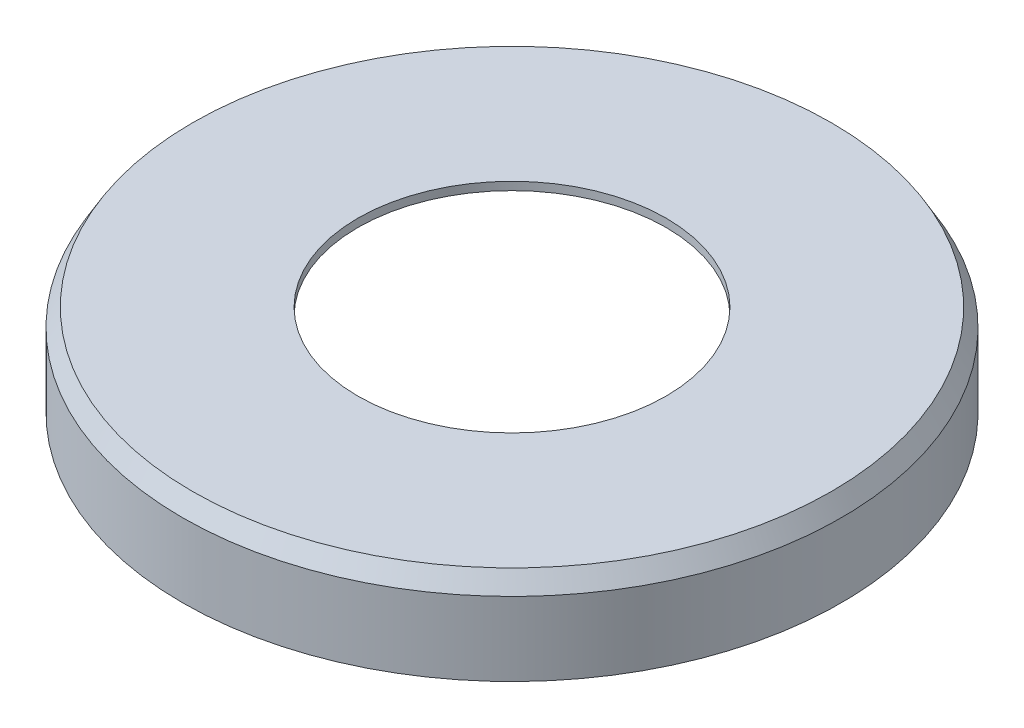
ISO-10303-21;
HEADER;
FILE_DESCRIPTION(('STEP AP214'),'2;1');
FILE_NAME('part.step','',(''),(''),'','','');
FILE_SCHEMA(('AUTOMOTIVE_DESIGN { 1 0 10303 214 1 1 1 1 }'));
ENDSEC;
DATA;
#1=APPLICATION_CONTEXT('core data for automotive mechanical design processes');
#2=APPLICATION_PROTOCOL_DEFINITION('international standard','automotive_design',2000,#1);
#3=PRODUCT_CONTEXT('',#1,'mechanical');
#4=PRODUCT('Part','Part','',(#3));
#5=PRODUCT_RELATED_PRODUCT_CATEGORY('part','',(#4));
#6=PRODUCT_DEFINITION_FORMATION('','',#4);
#7=PRODUCT_DEFINITION_CONTEXT('part definition',#1,'design');
#8=PRODUCT_DEFINITION('design','',#6,#7);
#9=PRODUCT_DEFINITION_SHAPE('','',#8);
#10=(LENGTH_UNIT() NAMED_UNIT(*) SI_UNIT(.MILLI.,.METRE.));
#11=(NAMED_UNIT(*) PLANE_ANGLE_UNIT() SI_UNIT($,.RADIAN.));
#12=(NAMED_UNIT(*) SI_UNIT($,.STERADIAN.) SOLID_ANGLE_UNIT());
#13=UNCERTAINTY_MEASURE_WITH_UNIT(LENGTH_MEASURE(1.E-05),#10,'distance_accuracy_value','');
#14=(GEOMETRIC_REPRESENTATION_CONTEXT(3) GLOBAL_UNCERTAINTY_ASSIGNED_CONTEXT((#13)) GLOBAL_UNIT_ASSIGNED_CONTEXT((#10,
#11,#12)) REPRESENTATION_CONTEXT('',''));
#15=CARTESIAN_POINT('',(0.,0.,0.));
#16=DIRECTION('',(0.,0.,1.));
#17=DIRECTION('',(1.,0.,0.));
#18=AXIS2_PLACEMENT_3D('',#15,#16,#17);
#19=CARTESIAN_POINT('',(0.,9.,0.));
#20=DIRECTION('',(0.,-1.,0.));
#21=DIRECTION('',(0.,0.,-1.));
#22=AXIS2_PLACEMENT_3D('',#19,#20,#21);
#23=CYLINDRICAL_SURFACE('',#22,15.2);
#24=CARTESIAN_POINT('',(0.,9.,0.));
#25=DIRECTION('',(0.,-1.,0.));
#26=DIRECTION('',(0.,0.,-1.));
#27=AXIS2_PLACEMENT_3D('',#24,#25,#26);
#28=CIRCLE('',#27,15.2);
#29=CARTESIAN_POINT('',(0.,9.,-15.2));
#30=VERTEX_POINT('',#29);
#31=EDGE_CURVE('E153',#30,#30,#28,.T.);
#32=ORIENTED_EDGE('',*,*,#31,.F.);
#33=EDGE_LOOP('',(#32));
#34=FACE_BOUND('',#33,.T.);
#35=CARTESIAN_POINT('',(0.,8.2,0.));
#36=DIRECTION('',(0.,-1.,0.));
#37=DIRECTION('',(0.,0.,-1.));
#38=AXIS2_PLACEMENT_3D('',#35,#36,#37);
#39=CIRCLE('',#38,15.2);
#40=CARTESIAN_POINT('',(0.,8.2,-15.2));
#41=VERTEX_POINT('',#40);
#42=EDGE_CURVE('E44',#41,#41,#39,.F.);
#43=ORIENTED_EDGE('',*,*,#42,.F.);
#44=EDGE_LOOP('',(#43));
#45=FACE_BOUND('',#44,.T.);
#46=ADVANCED_FACE('F39',(#34,#45),#23,.F.);
#47=CARTESIAN_POINT('',(0.,-82.731493398826,0.));
#48=DIRECTION('',(0.,1.,0.));
#49=DIRECTION('',(0.,0.,1.));
#50=AXIS2_PLACEMENT_3D('',#47,#48,#49);
#51=CYLINDRICAL_SURFACE('',#50,29.25);
#52=CARTESIAN_POINT('',(0.,0.,0.));
#53=DIRECTION('',(0.,1.,0.));
#54=DIRECTION('',(0.,0.,1.));
#55=AXIS2_PLACEMENT_3D('',#52,#53,#54);
#56=CIRCLE('',#55,29.25);
#57=CARTESIAN_POINT('',(-21.2063607461421,0.,-20.1457877459404));
#58=VERTEX_POINT('',#57);
#59=CARTESIAN_POINT('',(-21.2063607461424,0.,20.1457877459401));
#60=VERTEX_POINT('',#59);
#61=EDGE_CURVE('E56',#58,#60,#56,.T.);
#62=ORIENTED_EDGE('',*,*,#61,.F.);
#63=DIRECTION('',(0.,1.,0.));
#64=VECTOR('',#63,1.);
#65=CARTESIAN_POINT('',(-21.2063607461421,-16.7120855197695,-20.1457877459405));
#66=LINE('',#65,#64);
#67=CARTESIAN_POINT('',(-21.2063607461421,7.,-20.1457877459404));
#68=VERTEX_POINT('',#67);
#69=EDGE_CURVE('E163',#58,#68,#66,.T.);
#70=ORIENTED_EDGE('',*,*,#69,.T.);
#71=CARTESIAN_POINT('',(0.,7.,0.));
#72=DIRECTION('',(0.,-1.,0.));
#73=DIRECTION('',(0.,0.,-1.));
#74=AXIS2_PLACEMENT_3D('',#71,#72,#73);
#75=CIRCLE('',#74,29.25);
#76=CARTESIAN_POINT('',(-21.2063607461424,7.,20.1457877459401));
#77=VERTEX_POINT('',#76);
#78=EDGE_CURVE('E230',#77,#68,#75,.T.);
#79=ORIENTED_EDGE('',*,*,#78,.F.);
#80=DIRECTION('',(0.,1.,0.));
#81=VECTOR('',#80,1.);
#82=CARTESIAN_POINT('',(-21.2063607461424,-16.7120855197695,20.1457877459402));
#83=LINE('',#82,#81);
#84=EDGE_CURVE('E186',#60,#77,#83,.T.);
#85=ORIENTED_EDGE('',*,*,#84,.F.);
#86=EDGE_LOOP('',(#62,#70,#79,#85));
#87=FACE_BOUND('',#86,.T.);
#88=ADVANCED_FACE('F254',(#87),#51,.F.);
#89=CARTESIAN_POINT('',(-6.84358359416209,7.,-28.4381410009465));
#90=VERTEX_POINT('',#89);
#91=CARTESIAN_POINT('',(28.0499443403046,7.,-8.29235325500622));
#92=VERTEX_POINT('',#91);
#93=EDGE_CURVE('E206',#90,#92,#75,.T.);
#94=ORIENTED_EDGE('',*,*,#93,.F.);
#95=DIRECTION('',(0.,1.,0.));
#96=VECTOR('',#95,1.);
#97=CARTESIAN_POINT('',(-6.84358359416211,-16.7120855197695,-28.4381410009465));
#98=LINE('',#97,#96);
#99=CARTESIAN_POINT('',(-6.84358359416209,0.,-28.4381410009465));
#100=VERTEX_POINT('',#99);
#101=EDGE_CURVE('E64',#100,#90,#98,.T.);
#102=ORIENTED_EDGE('',*,*,#101,.F.);
#103=CARTESIAN_POINT('',(28.0499443403046,0.,-8.29235325500619));
#104=VERTEX_POINT('',#103);
#105=EDGE_CURVE('E231',#104,#100,#56,.T.);
#106=ORIENTED_EDGE('',*,*,#105,.F.);
#107=DIRECTION('',(0.,1.,0.));
#108=VECTOR('',#107,1.);
#109=CARTESIAN_POINT('',(28.0499443403046,-16.6764308126348,-8.29235325500619));
#110=LINE('',#109,#108);
#111=EDGE_CURVE('E218',#104,#92,#110,.T.);
#112=ORIENTED_EDGE('',*,*,#111,.T.);
#113=EDGE_LOOP('',(#94,#102,#106,#112));
#114=FACE_BOUND('',#113,.T.);
#115=ADVANCED_FACE('F260',(#114),#51,.F.);
#116=CARTESIAN_POINT('',(-6.84358359416249,0.,28.4381410009464));
#117=VERTEX_POINT('',#116);
#118=CARTESIAN_POINT('',(28.0499443403046,0.,8.29235325500619));
#119=VERTEX_POINT('',#118);
#120=EDGE_CURVE('E229',#117,#119,#56,.T.);
#121=ORIENTED_EDGE('',*,*,#120,.F.);
#122=DIRECTION('',(0.,1.,0.));
#123=VECTOR('',#122,1.);
#124=CARTESIAN_POINT('',(-6.84358359416251,-16.7120855197695,28.4381410009464));
#125=LINE('',#124,#123);
#126=CARTESIAN_POINT('',(-6.84358359416249,7.,28.4381410009464));
#127=VERTEX_POINT('',#126);
#128=EDGE_CURVE('E189',#117,#127,#125,.T.);
#129=ORIENTED_EDGE('',*,*,#128,.T.);
#130=CARTESIAN_POINT('',(28.0499443403046,7.,8.29235325500622));
#131=VERTEX_POINT('',#130);
#132=EDGE_CURVE('E226',#131,#127,#75,.T.);
#133=ORIENTED_EDGE('',*,*,#132,.F.);
#134=DIRECTION('',(0.,1.,0.));
#135=VECTOR('',#134,1.);
#136=CARTESIAN_POINT('',(28.0499443403046,-16.6764308126348,8.29235325500619));
#137=LINE('',#136,#135);
#138=EDGE_CURVE('E215',#119,#131,#137,.T.);
#139=ORIENTED_EDGE('',*,*,#138,.F.);
#140=EDGE_LOOP('',(#121,#129,#133,#139));
#141=FACE_BOUND('',#140,.T.);
#142=ADVANCED_FACE('F262',(#141),#51,.F.);
#143=CARTESIAN_POINT('',(0.,0.,0.));
#144=DIRECTION('',(0.,1.,0.));
#145=DIRECTION('',(0.,0.,1.));
#146=AXIS2_PLACEMENT_3D('',#143,#144,#145);
#147=PLANE('',#146);
#148=ORIENTED_EDGE('',*,*,#105,.T.);
#149=CARTESIAN_POINT('',(-7.57045706924845,0.,-28.2533304189553));
#150=DIRECTION('',(0.,1.,0.));
#151=DIRECTION('',(0.,0.,1.));
#152=AXIS2_PLACEMENT_3D('',#149,#150,#151);
#153=CIRCLE('',#152,0.750000000000001);
#154=CARTESIAN_POINT('',(-7.37634278542157,0.,-27.5288860492385));
#155=VERTEX_POINT('',#154);
#156=EDGE_CURVE('E158',#155,#100,#153,.T.);
#157=ORIENTED_EDGE('',*,*,#156,.F.);
#158=CARTESIAN_POINT('',(0.,0.,0.));
#159=DIRECTION('',(0.,1.,0.));
#160=DIRECTION('',(0.,0.,1.));
#161=AXIS2_PLACEMENT_3D('',#158,#159,#160);
#162=CIRCLE('',#161,28.5);
#163=CARTESIAN_POINT('',(-20.1525432638164,0.,-20.1525432638168));
#164=VERTEX_POINT('',#163);
#165=EDGE_CURVE('E146',#164,#155,#162,.F.);
#166=ORIENTED_EDGE('',*,*,#165,.F.);
#167=CARTESIAN_POINT('',(-20.6828733497063,0.,-20.6828733497067));
#168=DIRECTION('',(0.,1.,0.));
#169=DIRECTION('',(0.,0.,1.));
#170=AXIS2_PLACEMENT_3D('',#167,#168,#169);
#171=CIRCLE('',#170,0.750000000000001);
#172=EDGE_CURVE('E149',#58,#164,#171,.T.);
#173=ORIENTED_EDGE('',*,*,#172,.F.);
#174=ORIENTED_EDGE('',*,*,#61,.T.);
#175=CARTESIAN_POINT('',(-20.6828733497066,0.,20.6828733497064));
#176=DIRECTION('',(0.,1.,0.));
#177=DIRECTION('',(0.,0.,1.));
#178=AXIS2_PLACEMENT_3D('',#175,#176,#177);
#179=CIRCLE('',#178,0.750000000000001);
#180=CARTESIAN_POINT('',(-20.1525432638167,0.,20.1525432638165));
#181=VERTEX_POINT('',#180);
#182=EDGE_CURVE('E173',#181,#60,#179,.T.);
#183=ORIENTED_EDGE('',*,*,#182,.F.);
#184=CARTESIAN_POINT('',(0.,0.,0.));
#185=DIRECTION('',(0.,1.,0.));
#186=DIRECTION('',(0.,0.,1.));
#187=AXIS2_PLACEMENT_3D('',#184,#185,#186);
#188=CIRCLE('',#187,28.5);
#189=CARTESIAN_POINT('',(-7.37634278542195,0.,27.5288860492384));
#190=VERTEX_POINT('',#189);
#191=EDGE_CURVE('E169',#190,#181,#188,.F.);
#192=ORIENTED_EDGE('',*,*,#191,.F.);
#193=CARTESIAN_POINT('',(-7.57045706924884,0.,28.2533304189552));
#194=DIRECTION('',(0.,1.,0.));
#195=DIRECTION('',(0.,0.,1.));
#196=AXIS2_PLACEMENT_3D('',#193,#194,#195);
#197=CIRCLE('',#196,0.750000000000001);
#198=EDGE_CURVE('E166',#117,#190,#197,.T.);
#199=ORIENTED_EDGE('',*,*,#198,.F.);
#200=ORIENTED_EDGE('',*,*,#120,.T.);
#201=CARTESIAN_POINT('',(28.2533304189552,0.,7.57045706924876));
#202=DIRECTION('',(0.,1.,0.));
#203=DIRECTION('',(0.,0.,1.));
#204=AXIS2_PLACEMENT_3D('',#201,#202,#203);
#205=CIRCLE('',#204,0.750000000000001);
#206=CARTESIAN_POINT('',(27.5288860492384,0.,7.37634278542187));
#207=VERTEX_POINT('',#206);
#208=EDGE_CURVE('E203',#207,#119,#205,.T.);
#209=ORIENTED_EDGE('',*,*,#208,.F.);
#210=CARTESIAN_POINT('',(0.,0.,0.));
#211=DIRECTION('',(0.,1.,0.));
#212=DIRECTION('',(0.,0.,1.));
#213=AXIS2_PLACEMENT_3D('',#210,#211,#212);
#214=CIRCLE('',#213,28.5);
#215=CARTESIAN_POINT('',(27.5288860492384,0.,-7.37634278542186));
#216=VERTEX_POINT('',#215);
#217=EDGE_CURVE('E199',#216,#207,#214,.F.);
#218=ORIENTED_EDGE('',*,*,#217,.F.);
#219=CARTESIAN_POINT('',(28.2533304189552,0.,-7.57045706924876));
#220=DIRECTION('',(0.,1.,0.));
#221=DIRECTION('',(0.,0.,1.));
#222=AXIS2_PLACEMENT_3D('',#219,#220,#221);
#223=CIRCLE('',#222,0.750000000000001);
#224=EDGE_CURVE('E196',#104,#216,#223,.T.);
#225=ORIENTED_EDGE('',*,*,#224,.F.);
#226=EDGE_LOOP('',(#148,#157,#166,#173,#174,#183,#192,#199,#200,#209,#218,#225));
#227=FACE_BOUND('',#226,.T.);
#228=CARTESIAN_POINT('',(0.,0.,0.));
#229=DIRECTION('',(0.,1.,0.));
#230=DIRECTION('',(0.,0.,1.));
#231=AXIS2_PLACEMENT_3D('',#228,#229,#230);
#232=CIRCLE('',#231,32.5);
#233=CARTESIAN_POINT('',(0.,0.,32.5));
#234=VERTEX_POINT('',#233);
#235=EDGE_CURVE('E233',#234,#234,#232,.T.);
#236=ORIENTED_EDGE('',*,*,#235,.F.);
#237=EDGE_LOOP('',(#236));
#238=FACE_BOUND('',#237,.T.);
#239=ADVANCED_FACE('F298',(#227,#238),#147,.F.);
#240=CARTESIAN_POINT('',(0.,7.,0.));
#241=DIRECTION('',(0.,-1.,0.));
#242=DIRECTION('',(0.,0.,-1.));
#243=AXIS2_PLACEMENT_3D('',#240,#241,#242);
#244=CYLINDRICAL_SURFACE('',#243,32.5);
#245=CARTESIAN_POINT('',(0.,7.26794919243112,0.));
#246=DIRECTION('',(0.,1.,0.));
#247=DIRECTION('',(0.,0.,1.));
#248=AXIS2_PLACEMENT_3D('',#245,#246,#247);
#249=CIRCLE('',#248,32.5);
#250=CARTESIAN_POINT('',(0.,7.26794919243112,32.5));
#251=VERTEX_POINT('',#250);
#252=EDGE_CURVE('E11',#251,#251,#249,.F.);
#253=ORIENTED_EDGE('',*,*,#252,.T.);
#254=EDGE_LOOP('',(#253));
#255=FACE_BOUND('',#254,.T.);
#256=ORIENTED_EDGE('',*,*,#235,.T.);
#257=EDGE_LOOP('',(#256));
#258=FACE_BOUND('',#257,.T.);
#259=ADVANCED_FACE('F302',(#255,#258),#244,.T.);
#260=CARTESIAN_POINT('',(0.,9.,0.));
#261=DIRECTION('',(0.,1.,0.));
#262=DIRECTION('',(0.,0.,1.));
#263=AXIS2_PLACEMENT_3D('',#260,#261,#262);
#264=PLANE('',#263);
#265=ORIENTED_EDGE('',*,*,#31,.T.);
#266=EDGE_LOOP('',(#265));
#267=FACE_BOUND('',#266,.T.);
#268=CARTESIAN_POINT('',(0.,9.,0.));
#269=DIRECTION('',(0.,1.,0.));
#270=DIRECTION('',(0.,0.,1.));
#271=AXIS2_PLACEMENT_3D('',#268,#269,#270);
#272=CIRCLE('',#271,31.5);
#273=CARTESIAN_POINT('',(0.,9.,31.5));
#274=VERTEX_POINT('',#273);
#275=EDGE_CURVE('E49',#274,#274,#272,.T.);
#276=ORIENTED_EDGE('',*,*,#275,.T.);
#277=EDGE_LOOP('',(#276));
#278=FACE_BOUND('',#277,.T.);
#279=ADVANCED_FACE('F239',(#267,#278),#264,.T.);
#280=CARTESIAN_POINT('',(0.,7.,0.));
#281=DIRECTION('',(0.,1.,0.));
#282=DIRECTION('',(0.,0.,1.));
#283=AXIS2_PLACEMENT_3D('',#280,#281,#282);
#284=PLANE('',#283);
#285=CARTESIAN_POINT('',(0.,7.,0.));
#286=DIRECTION('',(0.,-1.,0.));
#287=DIRECTION('',(0.,0.,-1.));
#288=AXIS2_PLACEMENT_3D('',#285,#286,#287);
#289=CIRCLE('',#288,18.);
#290=CARTESIAN_POINT('',(0.,7.,-18.));
#291=VERTEX_POINT('',#290);
#292=EDGE_CURVE('E414',#291,#291,#289,.T.);
#293=ORIENTED_EDGE('',*,*,#292,.F.);
#294=EDGE_LOOP('',(#293));
#295=FACE_BOUND('',#294,.T.);
#296=CARTESIAN_POINT('',(-20.6828733497063,7.,-20.6828733497067));
#297=DIRECTION('',(0.,-1.,0.));
#298=DIRECTION('',(0.866025403784443,0.,-0.499999999999992));
#299=AXIS2_PLACEMENT_3D('',#296,#297,#298);
#300=CIRCLE('',#299,0.750000000000001);
#301=CARTESIAN_POINT('',(-20.1525432638164,7.,-20.1525432638168));
#302=VERTEX_POINT('',#301);
#303=EDGE_CURVE('E137',#302,#68,#300,.T.);
#304=ORIENTED_EDGE('',*,*,#303,.F.);
#305=CARTESIAN_POINT('',(0.,7.,0.));
#306=DIRECTION('',(0.,1.,0.));
#307=DIRECTION('',(0.866025403784443,0.,-0.499999999999992));
#308=AXIS2_PLACEMENT_3D('',#305,#306,#307);
#309=CIRCLE('',#308,28.5);
#310=CARTESIAN_POINT('',(-7.37634278542157,7.,-27.5288860492385));
#311=VERTEX_POINT('',#310);
#312=EDGE_CURVE('E130',#311,#302,#309,.T.);
#313=ORIENTED_EDGE('',*,*,#312,.F.);
#314=CARTESIAN_POINT('',(-7.57045706924845,7.,-28.2533304189553));
#315=DIRECTION('',(0.,-1.,0.));
#316=DIRECTION('',(-0.866025403784443,0.,0.499999999999992));
#317=AXIS2_PLACEMENT_3D('',#314,#315,#316);
#318=CIRCLE('',#317,0.750000000000001);
#319=EDGE_CURVE('E134',#90,#311,#318,.T.);
#320=ORIENTED_EDGE('',*,*,#319,.F.);
#321=ORIENTED_EDGE('',*,*,#93,.T.);
#322=CARTESIAN_POINT('',(28.2533304189552,7.,-7.57045706924876));
#323=DIRECTION('',(0.,-1.,0.));
#324=DIRECTION('',(0.,0.,1.));
#325=AXIS2_PLACEMENT_3D('',#322,#323,#324);
#326=CIRCLE('',#325,0.750000000000001);
#327=CARTESIAN_POINT('',(27.5288860492384,7.,-7.37634278542186));
#328=VERTEX_POINT('',#327);
#329=EDGE_CURVE('E212',#328,#92,#326,.T.);
#330=ORIENTED_EDGE('',*,*,#329,.F.);
#331=CARTESIAN_POINT('',(0.,7.,0.));
#332=DIRECTION('',(0.,1.,0.));
#333=DIRECTION('',(0.,0.,1.));
#334=AXIS2_PLACEMENT_3D('',#331,#332,#333);
#335=CIRCLE('',#334,28.5);
#336=CARTESIAN_POINT('',(27.5288860492384,7.,7.37634278542187));
#337=VERTEX_POINT('',#336);
#338=EDGE_CURVE('E209',#337,#328,#335,.T.);
#339=ORIENTED_EDGE('',*,*,#338,.F.);
#340=CARTESIAN_POINT('',(28.2533304189552,7.,7.57045706924876));
#341=DIRECTION('',(0.,-1.,0.));
#342=DIRECTION('',(0.,0.,-1.));
#343=AXIS2_PLACEMENT_3D('',#340,#341,#342);
#344=CIRCLE('',#343,0.750000000000001);
#345=EDGE_CURVE('E176',#131,#337,#344,.T.);
#346=ORIENTED_EDGE('',*,*,#345,.F.);
#347=ORIENTED_EDGE('',*,*,#132,.T.);
#348=CARTESIAN_POINT('',(-7.57045706924884,7.,28.2533304189552));
#349=DIRECTION('',(0.,-1.,0.));
#350=DIRECTION('',(-0.866025403784436,0.,-0.500000000000004));
#351=AXIS2_PLACEMENT_3D('',#348,#349,#350);
#352=CIRCLE('',#351,0.750000000000001);
#353=CARTESIAN_POINT('',(-7.37634278542195,7.,27.5288860492384));
#354=VERTEX_POINT('',#353);
#355=EDGE_CURVE('E183',#354,#127,#352,.T.);
#356=ORIENTED_EDGE('',*,*,#355,.F.);
#357=CARTESIAN_POINT('',(0.,7.,0.));
#358=DIRECTION('',(0.,1.,0.));
#359=DIRECTION('',(-0.866025403784436,0.,-0.500000000000004));
#360=AXIS2_PLACEMENT_3D('',#357,#358,#359);
#361=CIRCLE('',#360,28.5);
#362=CARTESIAN_POINT('',(-20.1525432638167,7.,20.1525432638165));
#363=VERTEX_POINT('',#362);
#364=EDGE_CURVE('E180',#363,#354,#361,.T.);
#365=ORIENTED_EDGE('',*,*,#364,.F.);
#366=CARTESIAN_POINT('',(-20.6828733497066,7.,20.6828733497064));
#367=DIRECTION('',(0.,-1.,0.));
#368=DIRECTION('',(0.866025403784436,0.,0.500000000000004));
#369=AXIS2_PLACEMENT_3D('',#366,#367,#368);
#370=CIRCLE('',#369,0.750000000000001);
#371=EDGE_CURVE('E177',#77,#363,#370,.T.);
#372=ORIENTED_EDGE('',*,*,#371,.F.);
#373=ORIENTED_EDGE('',*,*,#78,.T.);
#374=EDGE_LOOP('',(#304,#313,#320,#321,#330,#339,#346,#347,#356,#365,#372,#373));
#375=FACE_BOUND('',#374,.T.);
#376=ADVANCED_FACE('F132',(#295,#375),#284,.F.);
#377=CARTESIAN_POINT('',(28.2533304189552,-16.6764308126348,-7.57045706924876));
#378=DIRECTION('',(0.,1.,0.));
#379=DIRECTION('',(0.,0.,1.));
#380=AXIS2_PLACEMENT_3D('',#377,#378,#379);
#381=CYLINDRICAL_SURFACE('',#380,0.750000000000001);
#382=ORIENTED_EDGE('',*,*,#111,.F.);
#383=ORIENTED_EDGE('',*,*,#224,.T.);
#384=DIRECTION('',(0.,1.,0.));
#385=VECTOR('',#384,1.);
#386=CARTESIAN_POINT('',(27.5288860492384,-16.6764308126348,-7.37634278542186));
#387=LINE('',#386,#385);
#388=EDGE_CURVE('E221',#216,#328,#387,.T.);
#389=ORIENTED_EDGE('',*,*,#388,.T.);
#390=ORIENTED_EDGE('',*,*,#329,.T.);
#391=EDGE_LOOP('',(#382,#383,#389,#390));
#392=FACE_BOUND('',#391,.T.);
#393=ADVANCED_FACE('F286',(#392),#381,.T.);
#394=CARTESIAN_POINT('',(0.,-16.6764308126348,0.));
#395=DIRECTION('',(0.,1.,0.));
#396=DIRECTION('',(0.,0.,1.));
#397=AXIS2_PLACEMENT_3D('',#394,#395,#396);
#398=CYLINDRICAL_SURFACE('',#397,28.5);
#399=ORIENTED_EDGE('',*,*,#388,.F.);
#400=ORIENTED_EDGE('',*,*,#217,.T.);
#401=DIRECTION('',(0.,1.,0.));
#402=VECTOR('',#401,1.);
#403=CARTESIAN_POINT('',(27.5288860492384,-16.6764308126348,7.37634278542187));
#404=LINE('',#403,#402);
#405=EDGE_CURVE('E200',#207,#337,#404,.T.);
#406=ORIENTED_EDGE('',*,*,#405,.T.);
#407=ORIENTED_EDGE('',*,*,#338,.T.);
#408=EDGE_LOOP('',(#399,#400,#406,#407));
#409=FACE_BOUND('',#408,.T.);
#410=ADVANCED_FACE('F289',(#409),#398,.F.);
#411=CARTESIAN_POINT('',(28.2533304189552,-16.6764308126348,7.57045706924876));
#412=DIRECTION('',(0.,1.,0.));
#413=DIRECTION('',(0.,0.,1.));
#414=AXIS2_PLACEMENT_3D('',#411,#412,#413);
#415=CYLINDRICAL_SURFACE('',#414,0.750000000000001);
#416=ORIENTED_EDGE('',*,*,#405,.F.);
#417=ORIENTED_EDGE('',*,*,#208,.T.);
#418=ORIENTED_EDGE('',*,*,#138,.T.);
#419=ORIENTED_EDGE('',*,*,#345,.T.);
#420=EDGE_LOOP('',(#416,#417,#418,#419));
#421=FACE_BOUND('',#420,.T.);
#422=ADVANCED_FACE('F278',(#421),#415,.T.);
#423=CARTESIAN_POINT('',(-7.57045706924884,-16.7120855197695,28.2533304189552));
#424=DIRECTION('',(0.,1.,0.));
#425=DIRECTION('',(0.,0.,1.));
#426=AXIS2_PLACEMENT_3D('',#423,#424,#425);
#427=CYLINDRICAL_SURFACE('',#426,0.750000000000001);
#428=ORIENTED_EDGE('',*,*,#128,.F.);
#429=ORIENTED_EDGE('',*,*,#198,.T.);
#430=DIRECTION('',(0.,1.,0.));
#431=VECTOR('',#430,1.);
#432=CARTESIAN_POINT('',(-7.37634278542195,-16.7120855197695,27.5288860492384));
#433=LINE('',#432,#431);
#434=EDGE_CURVE('E191',#190,#354,#433,.T.);
#435=ORIENTED_EDGE('',*,*,#434,.T.);
#436=ORIENTED_EDGE('',*,*,#355,.T.);
#437=EDGE_LOOP('',(#428,#429,#435,#436));
#438=FACE_BOUND('',#437,.T.);
#439=ADVANCED_FACE('F274',(#438),#427,.T.);
#440=CARTESIAN_POINT('',(0.,-16.7120855197695,0.));
#441=DIRECTION('',(0.,1.,0.));
#442=DIRECTION('',(0.,0.,1.));
#443=AXIS2_PLACEMENT_3D('',#440,#441,#442);
#444=CYLINDRICAL_SURFACE('',#443,28.5);
#445=ORIENTED_EDGE('',*,*,#434,.F.);
#446=ORIENTED_EDGE('',*,*,#191,.T.);
#447=DIRECTION('',(0.,1.,0.));
#448=VECTOR('',#447,1.);
#449=CARTESIAN_POINT('',(-20.1525432638167,-16.7120855197695,20.1525432638165));
#450=LINE('',#449,#448);
#451=EDGE_CURVE('E170',#181,#363,#450,.T.);
#452=ORIENTED_EDGE('',*,*,#451,.T.);
#453=ORIENTED_EDGE('',*,*,#364,.T.);
#454=EDGE_LOOP('',(#445,#446,#452,#453));
#455=FACE_BOUND('',#454,.T.);
#456=ADVANCED_FACE('F277',(#455),#444,.F.);
#457=CARTESIAN_POINT('',(-20.6828733497066,-16.7120855197695,20.6828733497064));
#458=DIRECTION('',(0.,1.,0.));
#459=DIRECTION('',(0.,0.,1.));
#460=AXIS2_PLACEMENT_3D('',#457,#458,#459);
#461=CYLINDRICAL_SURFACE('',#460,0.750000000000001);
#462=ORIENTED_EDGE('',*,*,#451,.F.);
#463=ORIENTED_EDGE('',*,*,#182,.T.);
#464=ORIENTED_EDGE('',*,*,#84,.T.);
#465=ORIENTED_EDGE('',*,*,#371,.T.);
#466=EDGE_LOOP('',(#462,#463,#464,#465));
#467=FACE_BOUND('',#466,.T.);
#468=ADVANCED_FACE('F270',(#467),#461,.T.);
#469=CARTESIAN_POINT('',(-20.6828733497063,-16.7120855197695,-20.6828733497067));
#470=DIRECTION('',(0.,1.,0.));
#471=DIRECTION('',(0.,0.,1.));
#472=AXIS2_PLACEMENT_3D('',#469,#470,#471);
#473=CYLINDRICAL_SURFACE('',#472,0.750000000000001);
#474=ORIENTED_EDGE('',*,*,#69,.F.);
#475=ORIENTED_EDGE('',*,*,#172,.T.);
#476=DIRECTION('',(0.,1.,0.));
#477=VECTOR('',#476,1.);
#478=CARTESIAN_POINT('',(-20.1525432638164,-16.7120855197695,-20.1525432638168));
#479=LINE('',#478,#477);
#480=EDGE_CURVE('E150',#164,#302,#479,.T.);
#481=ORIENTED_EDGE('',*,*,#480,.T.);
#482=ORIENTED_EDGE('',*,*,#303,.T.);
#483=EDGE_LOOP('',(#474,#475,#481,#482));
#484=FACE_BOUND('',#483,.T.);
#485=ADVANCED_FACE('F267',(#484),#473,.T.);
#486=CARTESIAN_POINT('',(0.,-16.7120855197695,0.));
#487=DIRECTION('',(0.,1.,0.));
#488=DIRECTION('',(0.,0.,1.));
#489=AXIS2_PLACEMENT_3D('',#486,#487,#488);
#490=CYLINDRICAL_SURFACE('',#489,28.5);
#491=ORIENTED_EDGE('',*,*,#480,.F.);
#492=ORIENTED_EDGE('',*,*,#165,.T.);
#493=DIRECTION('',(0.,1.,0.));
#494=VECTOR('',#493,1.);
#495=CARTESIAN_POINT('',(-7.37634278542157,-16.7120855197695,-27.5288860492385));
#496=LINE('',#495,#494);
#497=EDGE_CURVE('E144',#155,#311,#496,.T.);
#498=ORIENTED_EDGE('',*,*,#497,.T.);
#499=ORIENTED_EDGE('',*,*,#312,.T.);
#500=EDGE_LOOP('',(#491,#492,#498,#499));
#501=FACE_BOUND('',#500,.T.);
#502=ADVANCED_FACE('F145',(#501),#490,.F.);
#503=CARTESIAN_POINT('',(-7.57045706924845,-16.7120855197695,-28.2533304189553));
#504=DIRECTION('',(0.,1.,0.));
#505=DIRECTION('',(0.,0.,1.));
#506=AXIS2_PLACEMENT_3D('',#503,#504,#505);
#507=CYLINDRICAL_SURFACE('',#506,0.750000000000001);
#508=ORIENTED_EDGE('',*,*,#497,.F.);
#509=ORIENTED_EDGE('',*,*,#156,.T.);
#510=ORIENTED_EDGE('',*,*,#101,.T.);
#511=ORIENTED_EDGE('',*,*,#319,.T.);
#512=EDGE_LOOP('',(#508,#509,#510,#511));
#513=FACE_BOUND('',#512,.T.);
#514=ADVANCED_FACE('F152',(#513),#507,.T.);
#515=CARTESIAN_POINT('',(0.,9.,0.));
#516=DIRECTION('',(0.,-1.,0.));
#517=DIRECTION('',(0.,0.,-1.));
#518=AXIS2_PLACEMENT_3D('',#515,#516,#517);
#519=CONICAL_SURFACE('',#518,31.5,0.5235987755983);
#520=ORIENTED_EDGE('',*,*,#252,.F.);
#521=EDGE_LOOP('',(#520));
#522=FACE_BOUND('',#521,.T.);
#523=ORIENTED_EDGE('',*,*,#275,.F.);
#524=EDGE_LOOP('',(#523));
#525=FACE_BOUND('',#524,.T.);
#526=ADVANCED_FACE('F42',(#522,#525),#519,.T.);
#527=CARTESIAN_POINT('',(0.,8.2,0.));
#528=DIRECTION('',(0.,-1.,0.));
#529=DIRECTION('',(0.,0.,-1.));
#530=AXIS2_PLACEMENT_3D('',#527,#528,#529);
#531=PLANE('',#530);
#532=CARTESIAN_POINT('',(0.,8.2,0.));
#533=DIRECTION('',(0.,-1.,0.));
#534=DIRECTION('',(0.,0.,-1.));
#535=AXIS2_PLACEMENT_3D('',#532,#533,#534);
#536=CIRCLE('',#535,18.);
#537=CARTESIAN_POINT('',(0.,8.2,-18.));
#538=VERTEX_POINT('',#537);
#539=EDGE_CURVE('E411',#538,#538,#536,.T.);
#540=ORIENTED_EDGE('',*,*,#539,.T.);
#541=EDGE_LOOP('',(#540));
#542=FACE_BOUND('',#541,.T.);
#543=ORIENTED_EDGE('',*,*,#42,.T.);
#544=EDGE_LOOP('',(#543));
#545=FACE_BOUND('',#544,.T.);
#546=ADVANCED_FACE('F242',(#542,#545),#531,.T.);
#547=CARTESIAN_POINT('',(0.,8.2,0.));
#548=DIRECTION('',(0.,-1.,0.));
#549=DIRECTION('',(0.,0.,-1.));
#550=AXIS2_PLACEMENT_3D('',#547,#548,#549);
#551=CYLINDRICAL_SURFACE('',#550,18.);
#552=ORIENTED_EDGE('',*,*,#539,.F.);
#553=EDGE_LOOP('',(#552));
#554=FACE_BOUND('',#553,.T.);
#555=ORIENTED_EDGE('',*,*,#292,.T.);
#556=EDGE_LOOP('',(#555));
#557=FACE_BOUND('',#556,.T.);
#558=ADVANCED_FACE('F249',(#554,#557),#551,.F.);
#559=CLOSED_SHELL('',(#46,#88,#115,#142,#239,#259,#279,#376,#393,#410,#422,#439,#456,#468,#485,
#502,#514,#526,#546,#558));
#560=MANIFOLD_SOLID_BREP('B2',#559);
#561=ADVANCED_BREP_SHAPE_REPRESENTATION('',(#18,#560),#14);
#562=SHAPE_DEFINITION_REPRESENTATION(#9,#561);
ENDSEC;
END-ISO-10303-21;
